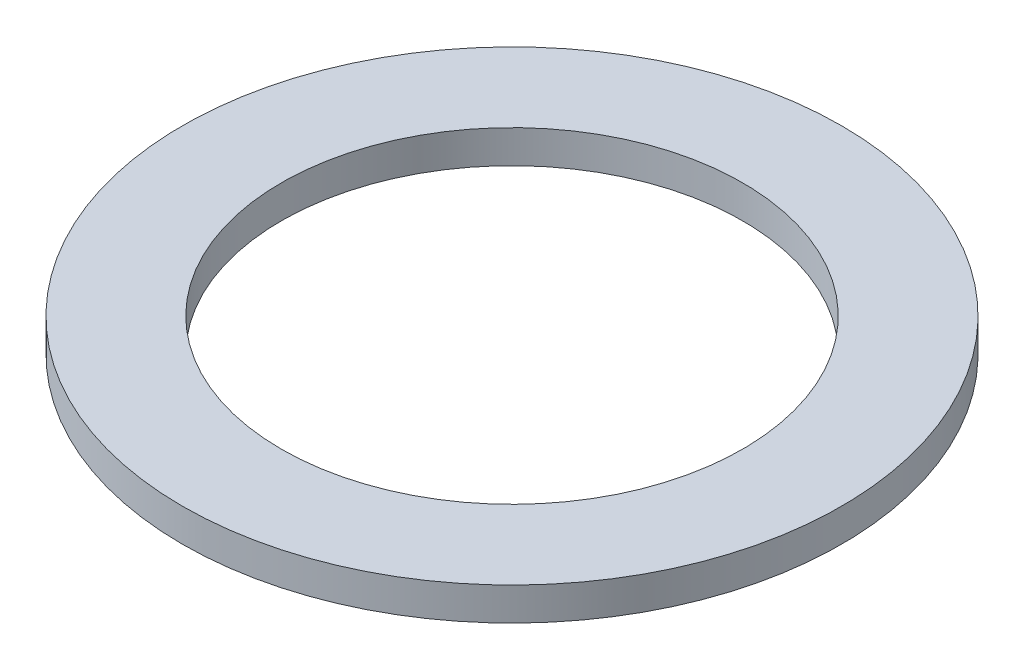
ISO-10303-21;
HEADER;
FILE_DESCRIPTION(('STEP AP214'),'2;1');
FILE_NAME('part.step','',(''),(''),'','','');
FILE_SCHEMA(('AUTOMOTIVE_DESIGN { 1 0 10303 214 1 1 1 1 }'));
ENDSEC;
DATA;
#1=APPLICATION_CONTEXT('core data for automotive mechanical design processes');
#2=APPLICATION_PROTOCOL_DEFINITION('international standard','automotive_design',2000,#1);
#3=PRODUCT_CONTEXT('',#1,'mechanical');
#4=PRODUCT('Part','Part','',(#3));
#5=PRODUCT_RELATED_PRODUCT_CATEGORY('part','',(#4));
#6=PRODUCT_DEFINITION_FORMATION('','',#4);
#7=PRODUCT_DEFINITION_CONTEXT('part definition',#1,'design');
#8=PRODUCT_DEFINITION('design','',#6,#7);
#9=PRODUCT_DEFINITION_SHAPE('','',#8);
#10=(LENGTH_UNIT() NAMED_UNIT(*) SI_UNIT(.MILLI.,.METRE.));
#11=(NAMED_UNIT(*) PLANE_ANGLE_UNIT() SI_UNIT($,.RADIAN.));
#12=(NAMED_UNIT(*) SI_UNIT($,.STERADIAN.) SOLID_ANGLE_UNIT());
#13=UNCERTAINTY_MEASURE_WITH_UNIT(LENGTH_MEASURE(1.E-05),#10,'distance_accuracy_value','');
#14=(GEOMETRIC_REPRESENTATION_CONTEXT(3) GLOBAL_UNCERTAINTY_ASSIGNED_CONTEXT((#13)) GLOBAL_UNIT_ASSIGNED_CONTEXT((#10,
#11,#12)) REPRESENTATION_CONTEXT('',''));
#15=CARTESIAN_POINT('',(0.,0.,0.));
#16=DIRECTION('',(0.,0.,1.));
#17=DIRECTION('',(1.,0.,0.));
#18=AXIS2_PLACEMENT_3D('',#15,#16,#17);
#19=CARTESIAN_POINT('',(0.,1.,0.));
#20=DIRECTION('',(0.,1.,0.));
#21=DIRECTION('',(0.,0.,1.));
#22=AXIS2_PLACEMENT_3D('',#19,#20,#21);
#23=PLANE('',#22);
#24=CARTESIAN_POINT('',(0.,1.,0.));
#25=DIRECTION('',(0.,1.,0.));
#26=DIRECTION('',(0.,0.,1.));
#27=AXIS2_PLACEMENT_3D('',#24,#25,#26);
#28=CIRCLE('',#27,10.);
#29=CARTESIAN_POINT('',(0.,1.,10.));
#30=VERTEX_POINT('',#29);
#31=EDGE_CURVE('E10',#30,#30,#28,.T.);
#32=ORIENTED_EDGE('',*,*,#31,.T.);
#33=EDGE_LOOP('',(#32));
#34=FACE_BOUND('',#33,.T.);
#35=CARTESIAN_POINT('',(0.,1.,0.));
#36=DIRECTION('',(0.,1.,0.));
#37=DIRECTION('',(0.,0.,1.));
#38=AXIS2_PLACEMENT_3D('',#35,#36,#37);
#39=CIRCLE('',#38,7.);
#40=CARTESIAN_POINT('',(0.,1.,7.));
#41=VERTEX_POINT('',#40);
#42=EDGE_CURVE('E50',#41,#41,#39,.T.);
#43=ORIENTED_EDGE('',*,*,#42,.F.);
#44=EDGE_LOOP('',(#43));
#45=FACE_BOUND('',#44,.T.);
#46=ADVANCED_FACE('F37',(#34,#45),#23,.T.);
#47=CARTESIAN_POINT('',(0.,0.,0.));
#48=DIRECTION('',(0.,1.,0.));
#49=DIRECTION('',(0.,0.,1.));
#50=AXIS2_PLACEMENT_3D('',#47,#48,#49);
#51=PLANE('',#50);
#52=CARTESIAN_POINT('',(0.,0.,0.));
#53=DIRECTION('',(0.,1.,0.));
#54=DIRECTION('',(0.,0.,1.));
#55=AXIS2_PLACEMENT_3D('',#52,#53,#54);
#56=CIRCLE('',#55,10.);
#57=CARTESIAN_POINT('',(0.,0.,10.));
#58=VERTEX_POINT('',#57);
#59=EDGE_CURVE('E41',#58,#58,#56,.T.);
#60=ORIENTED_EDGE('',*,*,#59,.F.);
#61=EDGE_LOOP('',(#60));
#62=FACE_BOUND('',#61,.T.);
#63=CARTESIAN_POINT('',(0.,0.,0.));
#64=DIRECTION('',(0.,1.,0.));
#65=DIRECTION('',(0.,0.,1.));
#66=AXIS2_PLACEMENT_3D('',#63,#64,#65);
#67=CIRCLE('',#66,7.);
#68=CARTESIAN_POINT('',(0.,0.,7.));
#69=VERTEX_POINT('',#68);
#70=EDGE_CURVE('E52',#69,#69,#67,.T.);
#71=ORIENTED_EDGE('',*,*,#70,.T.);
#72=EDGE_LOOP('',(#71));
#73=FACE_BOUND('',#72,.T.);
#74=ADVANCED_FACE('F64',(#62,#73),#51,.F.);
#75=CARTESIAN_POINT('',(0.,1.,0.));
#76=DIRECTION('',(0.,-1.,0.));
#77=DIRECTION('',(0.,0.,-1.));
#78=AXIS2_PLACEMENT_3D('',#75,#76,#77);
#79=CYLINDRICAL_SURFACE('',#78,10.);
#80=ORIENTED_EDGE('',*,*,#31,.F.);
#81=EDGE_LOOP('',(#80));
#82=FACE_BOUND('',#81,.T.);
#83=ORIENTED_EDGE('',*,*,#59,.T.);
#84=EDGE_LOOP('',(#83));
#85=FACE_BOUND('',#84,.T.);
#86=ADVANCED_FACE('F39',(#82,#85),#79,.T.);
#87=CARTESIAN_POINT('',(0.,1.,0.));
#88=DIRECTION('',(0.,-1.,0.));
#89=DIRECTION('',(0.,0.,-1.));
#90=AXIS2_PLACEMENT_3D('',#87,#88,#89);
#91=CYLINDRICAL_SURFACE('',#90,7.);
#92=ORIENTED_EDGE('',*,*,#42,.T.);
#93=EDGE_LOOP('',(#92));
#94=FACE_BOUND('',#93,.T.);
#95=ORIENTED_EDGE('',*,*,#70,.F.);
#96=EDGE_LOOP('',(#95));
#97=FACE_BOUND('',#96,.T.);
#98=ADVANCED_FACE('F60',(#94,#97),#91,.F.);
#99=CLOSED_SHELL('',(#46,#74,#86,#98));
#100=MANIFOLD_SOLID_BREP('B2',#99);
#101=ADVANCED_BREP_SHAPE_REPRESENTATION('',(#18,#100),#14);
#102=SHAPE_DEFINITION_REPRESENTATION(#9,#101);
ENDSEC;
END-ISO-10303-21;
